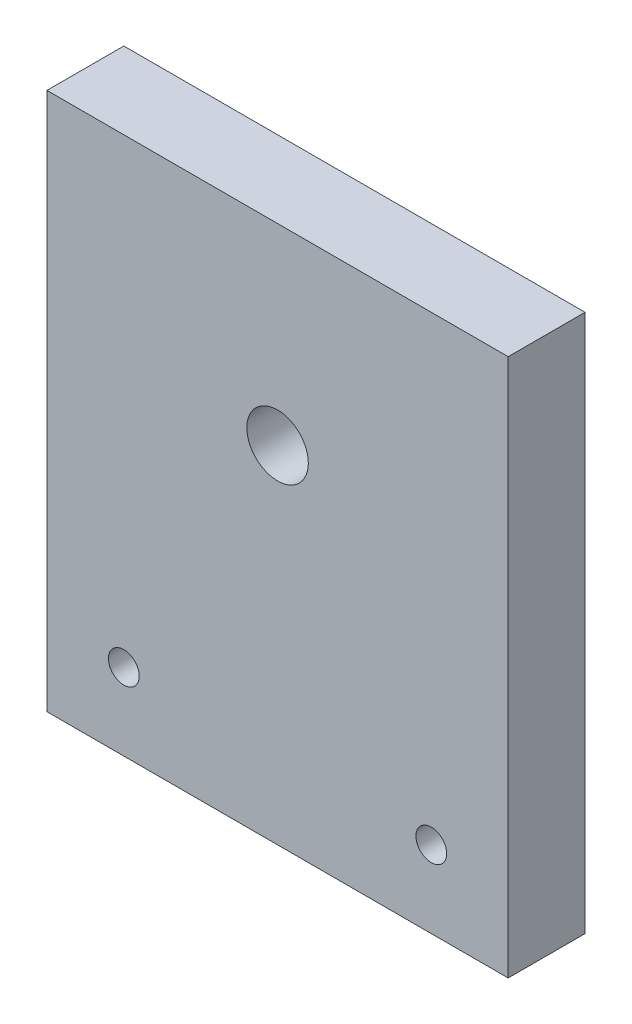
ISO-10303-21;
HEADER;
FILE_DESCRIPTION(('STEP AP214'),'2;1');
FILE_NAME('part.step','',(''),(''),'','','');
FILE_SCHEMA(('AUTOMOTIVE_DESIGN { 1 0 10303 214 1 1 1 1 }'));
ENDSEC;
DATA;
#1=APPLICATION_CONTEXT('core data for automotive mechanical design processes');
#2=APPLICATION_PROTOCOL_DEFINITION('international standard','automotive_design',2000,#1);
#3=PRODUCT_CONTEXT('',#1,'mechanical');
#4=PRODUCT('Part','Part','',(#3));
#5=PRODUCT_RELATED_PRODUCT_CATEGORY('part','',(#4));
#6=PRODUCT_DEFINITION_FORMATION('','',#4);
#7=PRODUCT_DEFINITION_CONTEXT('part definition',#1,'design');
#8=PRODUCT_DEFINITION('design','',#6,#7);
#9=PRODUCT_DEFINITION_SHAPE('','',#8);
#10=(LENGTH_UNIT() NAMED_UNIT(*) SI_UNIT(.MILLI.,.METRE.));
#11=(NAMED_UNIT(*) PLANE_ANGLE_UNIT() SI_UNIT($,.RADIAN.));
#12=(NAMED_UNIT(*) SI_UNIT($,.STERADIAN.) SOLID_ANGLE_UNIT());
#13=UNCERTAINTY_MEASURE_WITH_UNIT(LENGTH_MEASURE(1.E-05),#10,'distance_accuracy_value','');
#14=(GEOMETRIC_REPRESENTATION_CONTEXT(3) GLOBAL_UNCERTAINTY_ASSIGNED_CONTEXT((#13)) GLOBAL_UNIT_ASSIGNED_CONTEXT((#10,
#11,#12)) REPRESENTATION_CONTEXT('',''));
#15=CARTESIAN_POINT('',(0.,0.,0.));
#16=DIRECTION('',(0.,0.,1.));
#17=DIRECTION('',(1.,0.,0.));
#18=AXIS2_PLACEMENT_3D('',#15,#16,#17);
#19=CARTESIAN_POINT('',(30.,0.,10.));
#20=DIRECTION('',(1.,0.,0.));
#21=DIRECTION('',(0.,1.,0.));
#22=AXIS2_PLACEMENT_3D('',#19,#20,#21);
#23=PLANE('',#22);
#24=DIRECTION('',(0.,-1.,0.));
#25=VECTOR('',#24,1.);
#26=CARTESIAN_POINT('',(30.,0.,0.));
#27=LINE('',#26,#25);
#28=CARTESIAN_POINT('',(30.,25.,0.));
#29=VERTEX_POINT('',#28);
#30=CARTESIAN_POINT('',(30.,-45.,0.));
#31=VERTEX_POINT('',#30);
#32=EDGE_CURVE('E112',#29,#31,#27,.T.);
#33=ORIENTED_EDGE('',*,*,#32,.F.);
#34=DIRECTION('',(0.,0.,-1.));
#35=VECTOR('',#34,1.);
#36=CARTESIAN_POINT('',(30.,25.,10.));
#37=LINE('',#36,#35);
#38=CARTESIAN_POINT('',(30.,25.,10.));
#39=VERTEX_POINT('',#38);
#40=EDGE_CURVE('E11',#39,#29,#37,.T.);
#41=ORIENTED_EDGE('',*,*,#40,.F.);
#42=DIRECTION('',(0.,-1.,0.));
#43=VECTOR('',#42,1.);
#44=CARTESIAN_POINT('',(30.,0.,10.));
#45=LINE('',#44,#43);
#46=CARTESIAN_POINT('',(30.,-45.,10.));
#47=VERTEX_POINT('',#46);
#48=EDGE_CURVE('E96',#39,#47,#45,.T.);
#49=ORIENTED_EDGE('',*,*,#48,.T.);
#50=DIRECTION('',(0.,0.,-1.));
#51=VECTOR('',#50,1.);
#52=CARTESIAN_POINT('',(30.,-45.,10.));
#53=LINE('',#52,#51);
#54=EDGE_CURVE('E75',#47,#31,#53,.T.);
#55=ORIENTED_EDGE('',*,*,#54,.T.);
#56=EDGE_LOOP('',(#33,#41,#49,#55));
#57=FACE_BOUND('',#56,.T.);
#58=ADVANCED_FACE('F35',(#57),#23,.T.);
#59=CARTESIAN_POINT('',(0.,25.,10.));
#60=DIRECTION('',(0.,1.,0.));
#61=DIRECTION('',(0.,0.,1.));
#62=AXIS2_PLACEMENT_3D('',#59,#60,#61);
#63=PLANE('',#62);
#64=DIRECTION('',(1.,0.,0.));
#65=VECTOR('',#64,1.);
#66=CARTESIAN_POINT('',(0.,25.,0.));
#67=LINE('',#66,#65);
#68=CARTESIAN_POINT('',(-30.,25.,0.));
#69=VERTEX_POINT('',#68);
#70=EDGE_CURVE('E87',#69,#29,#67,.T.);
#71=ORIENTED_EDGE('',*,*,#70,.F.);
#72=DIRECTION('',(0.,0.,-1.));
#73=VECTOR('',#72,1.);
#74=CARTESIAN_POINT('',(-30.,25.,10.));
#75=LINE('',#74,#73);
#76=CARTESIAN_POINT('',(-30.,25.,10.));
#77=VERTEX_POINT('',#76);
#78=EDGE_CURVE('E44',#77,#69,#75,.T.);
#79=ORIENTED_EDGE('',*,*,#78,.F.);
#80=DIRECTION('',(1.,0.,0.));
#81=VECTOR('',#80,1.);
#82=CARTESIAN_POINT('',(0.,25.,10.));
#83=LINE('',#82,#81);
#84=EDGE_CURVE('E85',#77,#39,#83,.T.);
#85=ORIENTED_EDGE('',*,*,#84,.T.);
#86=ORIENTED_EDGE('',*,*,#40,.T.);
#87=EDGE_LOOP('',(#71,#79,#85,#86));
#88=FACE_BOUND('',#87,.T.);
#89=ADVANCED_FACE('F83',(#88),#63,.T.);
#90=CARTESIAN_POINT('',(-30.,0.,10.));
#91=DIRECTION('',(1.,0.,0.));
#92=DIRECTION('',(0.,1.,0.));
#93=AXIS2_PLACEMENT_3D('',#90,#91,#92);
#94=PLANE('',#93);
#95=DIRECTION('',(0.,-1.,0.));
#96=VECTOR('',#95,1.);
#97=CARTESIAN_POINT('',(-30.,0.,0.));
#98=LINE('',#97,#96);
#99=CARTESIAN_POINT('',(-30.,-45.,0.));
#100=VERTEX_POINT('',#99);
#101=EDGE_CURVE('E115',#69,#100,#98,.T.);
#102=ORIENTED_EDGE('',*,*,#101,.T.);
#103=DIRECTION('',(0.,0.,-1.));
#104=VECTOR('',#103,1.);
#105=CARTESIAN_POINT('',(-30.,-45.,10.));
#106=LINE('',#105,#104);
#107=CARTESIAN_POINT('',(-30.,-45.,10.));
#108=VERTEX_POINT('',#107);
#109=EDGE_CURVE('E90',#108,#100,#106,.T.);
#110=ORIENTED_EDGE('',*,*,#109,.F.);
#111=DIRECTION('',(0.,-1.,0.));
#112=VECTOR('',#111,1.);
#113=CARTESIAN_POINT('',(-30.,0.,10.));
#114=LINE('',#113,#112);
#115=EDGE_CURVE('E92',#77,#108,#114,.T.);
#116=ORIENTED_EDGE('',*,*,#115,.F.);
#117=ORIENTED_EDGE('',*,*,#78,.T.);
#118=EDGE_LOOP('',(#102,#110,#116,#117));
#119=FACE_BOUND('',#118,.T.);
#120=ADVANCED_FACE('F93',(#119),#94,.F.);
#121=CARTESIAN_POINT('',(-20.,-35.,10.));
#122=DIRECTION('',(0.,0.,-1.));
#123=DIRECTION('',(-1.,0.,0.));
#124=AXIS2_PLACEMENT_3D('',#121,#122,#123);
#125=CYLINDRICAL_SURFACE('',#124,2.);
#126=CARTESIAN_POINT('',(-20.,-35.,10.));
#127=DIRECTION('',(0.,0.,1.));
#128=DIRECTION('',(1.,0.,0.));
#129=AXIS2_PLACEMENT_3D('',#126,#127,#128);
#130=CIRCLE('',#129,2.);
#131=CARTESIAN_POINT('',(-18.,-35.,10.));
#132=VERTEX_POINT('',#131);
#133=EDGE_CURVE('E98',#132,#132,#130,.T.);
#134=ORIENTED_EDGE('',*,*,#133,.T.);
#135=EDGE_LOOP('',(#134));
#136=FACE_BOUND('',#135,.T.);
#137=CARTESIAN_POINT('',(-20.,-35.,0.));
#138=DIRECTION('',(0.,0.,1.));
#139=DIRECTION('',(1.,0.,0.));
#140=AXIS2_PLACEMENT_3D('',#137,#138,#139);
#141=CIRCLE('',#140,2.);
#142=CARTESIAN_POINT('',(-18.,-35.,0.));
#143=VERTEX_POINT('',#142);
#144=EDGE_CURVE('E109',#143,#143,#141,.T.);
#145=ORIENTED_EDGE('',*,*,#144,.F.);
#146=EDGE_LOOP('',(#145));
#147=FACE_BOUND('',#146,.T.);
#148=ADVANCED_FACE('F131',(#136,#147),#125,.F.);
#149=CARTESIAN_POINT('',(20.,-35.,10.));
#150=DIRECTION('',(0.,0.,-1.));
#151=DIRECTION('',(-1.,0.,0.));
#152=AXIS2_PLACEMENT_3D('',#149,#150,#151);
#153=CYLINDRICAL_SURFACE('',#152,2.);
#154=CARTESIAN_POINT('',(20.,-35.,10.));
#155=DIRECTION('',(0.,0.,1.));
#156=DIRECTION('',(1.,0.,0.));
#157=AXIS2_PLACEMENT_3D('',#154,#155,#156);
#158=CIRCLE('',#157,2.);
#159=CARTESIAN_POINT('',(22.,-35.,10.));
#160=VERTEX_POINT('',#159);
#161=EDGE_CURVE('E144',#160,#160,#158,.T.);
#162=ORIENTED_EDGE('',*,*,#161,.T.);
#163=EDGE_LOOP('',(#162));
#164=FACE_BOUND('',#163,.T.);
#165=CARTESIAN_POINT('',(20.,-35.,0.));
#166=DIRECTION('',(0.,0.,1.));
#167=DIRECTION('',(1.,0.,0.));
#168=AXIS2_PLACEMENT_3D('',#165,#166,#167);
#169=CIRCLE('',#168,2.);
#170=CARTESIAN_POINT('',(22.,-35.,0.));
#171=VERTEX_POINT('',#170);
#172=EDGE_CURVE('E106',#171,#171,#169,.T.);
#173=ORIENTED_EDGE('',*,*,#172,.F.);
#174=EDGE_LOOP('',(#173));
#175=FACE_BOUND('',#174,.T.);
#176=ADVANCED_FACE('F133',(#164,#175),#153,.F.);
#177=CARTESIAN_POINT('',(0.,0.,10.));
#178=DIRECTION('',(0.,0.,-1.));
#179=DIRECTION('',(-1.,0.,0.));
#180=AXIS2_PLACEMENT_3D('',#177,#178,#179);
#181=CYLINDRICAL_SURFACE('',#180,4.);
#182=CARTESIAN_POINT('',(0.,0.,10.));
#183=DIRECTION('',(0.,0.,1.));
#184=DIRECTION('',(1.,0.,0.));
#185=AXIS2_PLACEMENT_3D('',#182,#183,#184);
#186=CIRCLE('',#185,4.);
#187=CARTESIAN_POINT('',(4.,0.,10.));
#188=VERTEX_POINT('',#187);
#189=EDGE_CURVE('E118',#188,#188,#186,.T.);
#190=ORIENTED_EDGE('',*,*,#189,.T.);
#191=EDGE_LOOP('',(#190));
#192=FACE_BOUND('',#191,.T.);
#193=CARTESIAN_POINT('',(0.,0.,0.));
#194=DIRECTION('',(0.,0.,1.));
#195=DIRECTION('',(1.,0.,0.));
#196=AXIS2_PLACEMENT_3D('',#193,#194,#195);
#197=CIRCLE('',#196,4.);
#198=CARTESIAN_POINT('',(4.,0.,0.));
#199=VERTEX_POINT('',#198);
#200=EDGE_CURVE('E103',#199,#199,#197,.T.);
#201=ORIENTED_EDGE('',*,*,#200,.F.);
#202=EDGE_LOOP('',(#201));
#203=FACE_BOUND('',#202,.T.);
#204=ADVANCED_FACE('F37',(#192,#203),#181,.F.);
#205=CARTESIAN_POINT('',(0.,-45.,10.));
#206=DIRECTION('',(0.,1.,0.));
#207=DIRECTION('',(0.,0.,1.));
#208=AXIS2_PLACEMENT_3D('',#205,#206,#207);
#209=PLANE('',#208);
#210=DIRECTION('',(1.,0.,0.));
#211=VECTOR('',#210,1.);
#212=CARTESIAN_POINT('',(0.,-45.,0.));
#213=LINE('',#212,#211);
#214=EDGE_CURVE('E68',#100,#31,#213,.T.);
#215=ORIENTED_EDGE('',*,*,#214,.T.);
#216=ORIENTED_EDGE('',*,*,#54,.F.);
#217=DIRECTION('',(1.,0.,0.));
#218=VECTOR('',#217,1.);
#219=CARTESIAN_POINT('',(0.,-45.,10.));
#220=LINE('',#219,#218);
#221=EDGE_CURVE('E52',#108,#47,#220,.T.);
#222=ORIENTED_EDGE('',*,*,#221,.F.);
#223=ORIENTED_EDGE('',*,*,#109,.T.);
#224=EDGE_LOOP('',(#215,#216,#222,#223));
#225=FACE_BOUND('',#224,.T.);
#226=ADVANCED_FACE('F121',(#225),#209,.F.);
#227=CARTESIAN_POINT('',(0.,0.,10.));
#228=DIRECTION('',(0.,0.,1.));
#229=DIRECTION('',(1.,0.,0.));
#230=AXIS2_PLACEMENT_3D('',#227,#228,#229);
#231=PLANE('',#230);
#232=ORIENTED_EDGE('',*,*,#189,.F.);
#233=EDGE_LOOP('',(#232));
#234=FACE_BOUND('',#233,.T.);
#235=ORIENTED_EDGE('',*,*,#161,.F.);
#236=EDGE_LOOP('',(#235));
#237=FACE_BOUND('',#236,.T.);
#238=ORIENTED_EDGE('',*,*,#133,.F.);
#239=EDGE_LOOP('',(#238));
#240=FACE_BOUND('',#239,.T.);
#241=ORIENTED_EDGE('',*,*,#48,.F.);
#242=ORIENTED_EDGE('',*,*,#84,.F.);
#243=ORIENTED_EDGE('',*,*,#115,.T.);
#244=ORIENTED_EDGE('',*,*,#221,.T.);
#245=EDGE_LOOP('',(#241,#242,#243,#244));
#246=FACE_BOUND('',#245,.T.);
#247=ADVANCED_FACE('F95',(#234,#237,#240,#246),#231,.T.);
#248=CARTESIAN_POINT('',(0.,0.,0.));
#249=DIRECTION('',(0.,0.,1.));
#250=DIRECTION('',(1.,0.,0.));
#251=AXIS2_PLACEMENT_3D('',#248,#249,#250);
#252=PLANE('',#251);
#253=ORIENTED_EDGE('',*,*,#200,.T.);
#254=EDGE_LOOP('',(#253));
#255=FACE_BOUND('',#254,.T.);
#256=ORIENTED_EDGE('',*,*,#172,.T.);
#257=EDGE_LOOP('',(#256));
#258=FACE_BOUND('',#257,.T.);
#259=ORIENTED_EDGE('',*,*,#144,.T.);
#260=EDGE_LOOP('',(#259));
#261=FACE_BOUND('',#260,.T.);
#262=ORIENTED_EDGE('',*,*,#32,.T.);
#263=ORIENTED_EDGE('',*,*,#214,.F.);
#264=ORIENTED_EDGE('',*,*,#101,.F.);
#265=ORIENTED_EDGE('',*,*,#70,.T.);
#266=EDGE_LOOP('',(#262,#263,#264,#265));
#267=FACE_BOUND('',#266,.T.);
#268=ADVANCED_FACE('F122',(#255,#258,#261,#267),#252,.F.);
#269=CLOSED_SHELL('',(#58,#89,#120,#148,#176,#204,#226,#247,#268));
#270=MANIFOLD_SOLID_BREP('B2',#269);
#271=ADVANCED_BREP_SHAPE_REPRESENTATION('',(#18,#270),#14);
#272=SHAPE_DEFINITION_REPRESENTATION(#9,#271);
ENDSEC;
END-ISO-10303-21;
